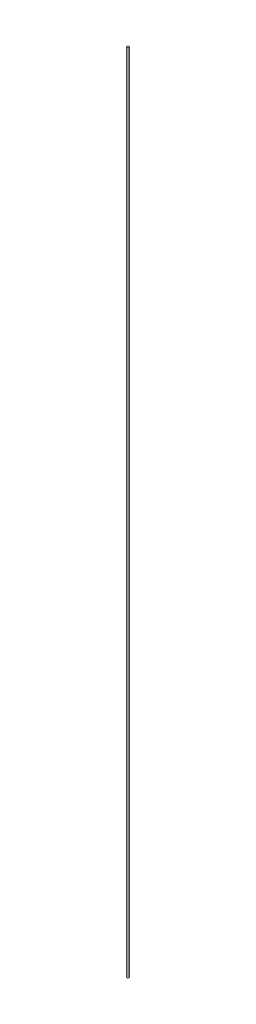
ISO-10303-21;
HEADER;
FILE_DESCRIPTION(('STEP AP214'),'2;1');
FILE_NAME('part.step','',(''),(''),'','','');
FILE_SCHEMA(('AUTOMOTIVE_DESIGN { 1 0 10303 214 1 1 1 1 }'));
ENDSEC;
DATA;
#1=APPLICATION_CONTEXT('core data for automotive mechanical design processes');
#2=APPLICATION_PROTOCOL_DEFINITION('international standard','automotive_design',2000,#1);
#3=PRODUCT_CONTEXT('',#1,'mechanical');
#4=PRODUCT('Part','Part','',(#3));
#5=PRODUCT_RELATED_PRODUCT_CATEGORY('part','',(#4));
#6=PRODUCT_DEFINITION_FORMATION('','',#4);
#7=PRODUCT_DEFINITION_CONTEXT('part definition',#1,'design');
#8=PRODUCT_DEFINITION('design','',#6,#7);
#9=PRODUCT_DEFINITION_SHAPE('','',#8);
#10=(LENGTH_UNIT() NAMED_UNIT(*) SI_UNIT(.MILLI.,.METRE.));
#11=(NAMED_UNIT(*) PLANE_ANGLE_UNIT() SI_UNIT($,.RADIAN.));
#12=(NAMED_UNIT(*) SI_UNIT($,.STERADIAN.) SOLID_ANGLE_UNIT());
#13=UNCERTAINTY_MEASURE_WITH_UNIT(LENGTH_MEASURE(1.E-05),#10,'distance_accuracy_value','');
#14=(GEOMETRIC_REPRESENTATION_CONTEXT(3) GLOBAL_UNCERTAINTY_ASSIGNED_CONTEXT((#13)) GLOBAL_UNIT_ASSIGNED_CONTEXT((#10,
#11,#12)) REPRESENTATION_CONTEXT('',''));
#15=CARTESIAN_POINT('',(0.,0.,0.));
#16=DIRECTION('',(0.,0.,1.));
#17=DIRECTION('',(1.,0.,0.));
#18=AXIS2_PLACEMENT_3D('',#15,#16,#17);
#19=CARTESIAN_POINT('',(0.,445.,0.));
#20=DIRECTION('',(0.,-1.,0.));
#21=DIRECTION('',(0.,0.,-1.));
#22=AXIS2_PLACEMENT_3D('',#19,#20,#21);
#23=CYLINDRICAL_SURFACE('',#22,0.5);
#24=CARTESIAN_POINT('',(0.,445.,0.));
#25=DIRECTION('',(0.,1.,0.));
#26=DIRECTION('',(0.,0.,1.));
#27=AXIS2_PLACEMENT_3D('',#24,#25,#26);
#28=CIRCLE('',#27,0.5);
#29=CARTESIAN_POINT('',(0.,445.,0.5));
#30=VERTEX_POINT('',#29);
#31=EDGE_CURVE('E10',#30,#30,#28,.T.);
#32=ORIENTED_EDGE('',*,*,#31,.F.);
#33=EDGE_LOOP('',(#32));
#34=FACE_BOUND('',#33,.T.);
#35=CARTESIAN_POINT('',(0.,0.,0.));
#36=DIRECTION('',(0.,1.,0.));
#37=DIRECTION('',(0.,0.,1.));
#38=AXIS2_PLACEMENT_3D('',#35,#36,#37);
#39=CIRCLE('',#38,0.5);
#40=CARTESIAN_POINT('',(0.,0.,0.5));
#41=VERTEX_POINT('',#40);
#42=EDGE_CURVE('E34',#41,#41,#39,.T.);
#43=ORIENTED_EDGE('',*,*,#42,.T.);
#44=EDGE_LOOP('',(#43));
#45=FACE_BOUND('',#44,.T.);
#46=ADVANCED_FACE('F31',(#34,#45),#23,.T.);
#47=CARTESIAN_POINT('',(0.,445.,0.));
#48=DIRECTION('',(0.,1.,0.));
#49=DIRECTION('',(0.,0.,1.));
#50=AXIS2_PLACEMENT_3D('',#47,#48,#49);
#51=PLANE('',#50);
#52=ORIENTED_EDGE('',*,*,#31,.T.);
#53=EDGE_LOOP('',(#52));
#54=FACE_BOUND('',#53,.T.);
#55=ADVANCED_FACE('F46',(#54),#51,.T.);
#56=CARTESIAN_POINT('',(0.,0.,0.));
#57=DIRECTION('',(0.,1.,0.));
#58=DIRECTION('',(0.,0.,1.));
#59=AXIS2_PLACEMENT_3D('',#56,#57,#58);
#60=PLANE('',#59);
#61=ORIENTED_EDGE('',*,*,#42,.F.);
#62=EDGE_LOOP('',(#61));
#63=FACE_BOUND('',#62,.T.);
#64=ADVANCED_FACE('F44',(#63),#60,.F.);
#65=CLOSED_SHELL('',(#46,#55,#64));
#66=MANIFOLD_SOLID_BREP('B2',#65);
#67=ADVANCED_BREP_SHAPE_REPRESENTATION('',(#18,#66),#14);
#68=SHAPE_DEFINITION_REPRESENTATION(#9,#67);
ENDSEC;
END-ISO-10303-21;
